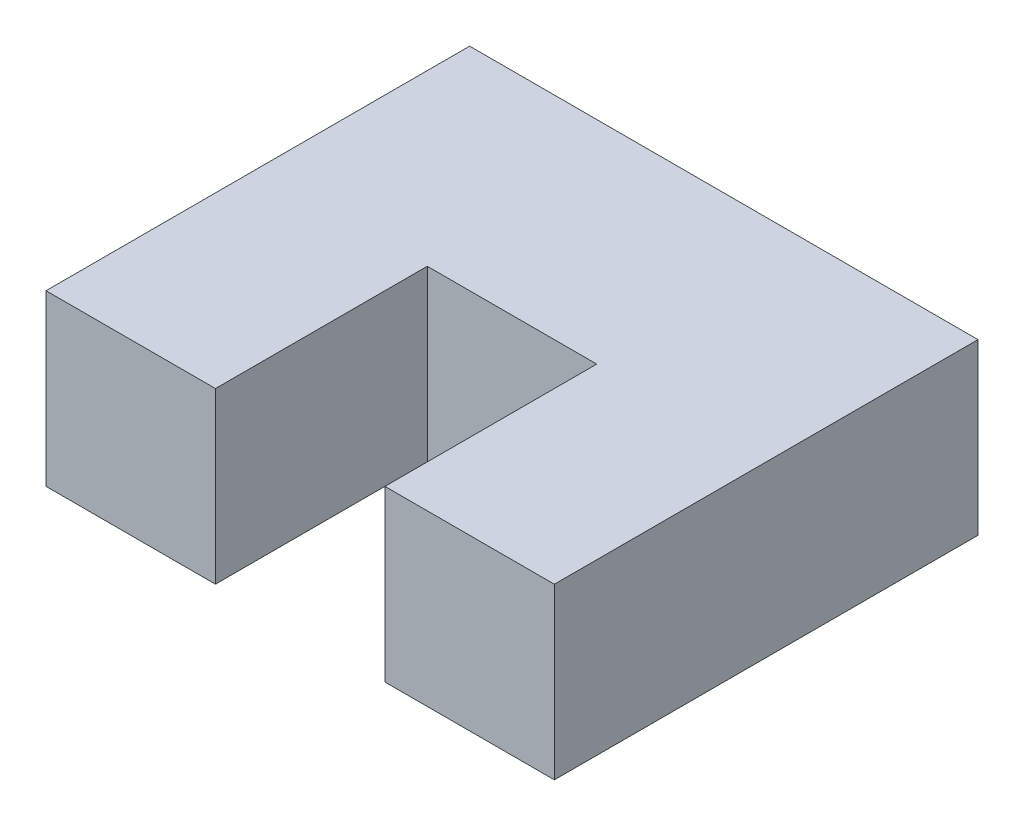
ISO-10303-21;
HEADER;
FILE_DESCRIPTION(('STEP AP214'),'2;1');
FILE_NAME('part.step','',(''),(''),'','','');
FILE_SCHEMA(('AUTOMOTIVE_DESIGN { 1 0 10303 214 1 1 1 1 }'));
ENDSEC;
DATA;
#1=APPLICATION_CONTEXT('core data for automotive mechanical design processes');
#2=APPLICATION_PROTOCOL_DEFINITION('international standard','automotive_design',2000,#1);
#3=PRODUCT_CONTEXT('',#1,'mechanical');
#4=PRODUCT('Part','Part','',(#3));
#5=PRODUCT_RELATED_PRODUCT_CATEGORY('part','',(#4));
#6=PRODUCT_DEFINITION_FORMATION('','',#4);
#7=PRODUCT_DEFINITION_CONTEXT('part definition',#1,'design');
#8=PRODUCT_DEFINITION('design','',#6,#7);
#9=PRODUCT_DEFINITION_SHAPE('','',#8);
#10=(LENGTH_UNIT() NAMED_UNIT(*) SI_UNIT(.MILLI.,.METRE.));
#11=(NAMED_UNIT(*) PLANE_ANGLE_UNIT() SI_UNIT($,.RADIAN.));
#12=(NAMED_UNIT(*) SI_UNIT($,.STERADIAN.) SOLID_ANGLE_UNIT());
#13=UNCERTAINTY_MEASURE_WITH_UNIT(LENGTH_MEASURE(1.E-05),#10,'distance_accuracy_value','');
#14=(GEOMETRIC_REPRESENTATION_CONTEXT(3) GLOBAL_UNCERTAINTY_ASSIGNED_CONTEXT((#13)) GLOBAL_UNIT_ASSIGNED_CONTEXT((#10,
#11,#12)) REPRESENTATION_CONTEXT('',''));
#15=CARTESIAN_POINT('',(0.,0.,0.));
#16=DIRECTION('',(0.,0.,1.));
#17=DIRECTION('',(1.,0.,0.));
#18=AXIS2_PLACEMENT_3D('',#15,#16,#17);
#19=CARTESIAN_POINT('',(30.0000000000001,-9.99999999999998,30.));
#20=DIRECTION('',(-1.,0.,0.));
#21=DIRECTION('',(0.,0.,1.));
#22=AXIS2_PLACEMENT_3D('',#19,#20,#21);
#23=PLANE('',#22);
#24=DIRECTION('',(0.,1.,0.));
#25=VECTOR('',#24,1.);
#26=CARTESIAN_POINT('',(30.0000000000001,-9.99999999999998,0.));
#27=LINE('',#26,#25);
#28=CARTESIAN_POINT('',(30.0000000000001,-9.99999999999998,0.));
#29=VERTEX_POINT('',#28);
#30=CARTESIAN_POINT('',(30.0000000000001,9.99999999999998,0.));
#31=VERTEX_POINT('',#30);
#32=EDGE_CURVE('E115',#29,#31,#27,.T.);
#33=ORIENTED_EDGE('',*,*,#32,.T.);
#34=DIRECTION('',(0.,0.,-1.));
#35=VECTOR('',#34,1.);
#36=CARTESIAN_POINT('',(30.0000000000001,9.99999999999998,30.));
#37=LINE('',#36,#35);
#38=CARTESIAN_POINT('',(30.0000000000001,9.99999999999998,50.));
#39=VERTEX_POINT('',#38);
#40=EDGE_CURVE('E11',#39,#31,#37,.T.);
#41=ORIENTED_EDGE('',*,*,#40,.F.);
#42=DIRECTION('',(0.,1.,0.));
#43=VECTOR('',#42,1.);
#44=CARTESIAN_POINT('',(30.0000000000001,9.99999999999998,50.));
#45=LINE('',#44,#43);
#46=CARTESIAN_POINT('',(30.0000000000001,-9.99999999999998,50.));
#47=VERTEX_POINT('',#46);
#48=EDGE_CURVE('E126',#47,#39,#45,.T.);
#49=ORIENTED_EDGE('',*,*,#48,.F.);
#50=DIRECTION('',(0.,0.,-1.));
#51=VECTOR('',#50,1.);
#52=CARTESIAN_POINT('',(30.0000000000001,-9.99999999999998,30.));
#53=LINE('',#52,#51);
#54=EDGE_CURVE('E121',#47,#29,#53,.T.);
#55=ORIENTED_EDGE('',*,*,#54,.T.);
#56=EDGE_LOOP('',(#33,#41,#49,#55));
#57=FACE_BOUND('',#56,.T.);
#58=ADVANCED_FACE('F39',(#57),#23,.F.);
#59=CARTESIAN_POINT('',(-29.9999999999999,9.99999999999998,30.));
#60=DIRECTION('',(0.,-1.,0.));
#61=DIRECTION('',(0.,0.,-1.));
#62=AXIS2_PLACEMENT_3D('',#59,#60,#61);
#63=PLANE('',#62);
#64=DIRECTION('',(-1.,0.,0.));
#65=VECTOR('',#64,1.);
#66=CARTESIAN_POINT('',(-10.,9.99999999999998,25.));
#67=LINE('',#66,#65);
#68=CARTESIAN_POINT('',(10.,9.99999999999998,25.));
#69=VERTEX_POINT('',#68);
#70=CARTESIAN_POINT('',(-10.,9.99999999999998,25.));
#71=VERTEX_POINT('',#70);
#72=EDGE_CURVE('E157',#69,#71,#67,.T.);
#73=ORIENTED_EDGE('',*,*,#72,.F.);
#74=DIRECTION('',(0.,0.,1.));
#75=VECTOR('',#74,1.);
#76=CARTESIAN_POINT('',(10.,9.99999999999998,25.));
#77=LINE('',#76,#75);
#78=CARTESIAN_POINT('',(10.,9.99999999999998,50.));
#79=VERTEX_POINT('',#78);
#80=EDGE_CURVE('E167',#69,#79,#77,.T.);
#81=ORIENTED_EDGE('',*,*,#80,.T.);
#82=DIRECTION('',(-1.,0.,0.));
#83=VECTOR('',#82,1.);
#84=CARTESIAN_POINT('',(10.,9.99999999999998,50.));
#85=LINE('',#84,#83);
#86=EDGE_CURVE('E131',#39,#79,#85,.T.);
#87=ORIENTED_EDGE('',*,*,#86,.F.);
#88=ORIENTED_EDGE('',*,*,#40,.T.);
#89=DIRECTION('',(-1.,0.,0.));
#90=VECTOR('',#89,1.);
#91=CARTESIAN_POINT('',(-29.9999999999999,9.99999999999998,0.));
#92=LINE('',#91,#90);
#93=CARTESIAN_POINT('',(-29.9999999999999,9.99999999999998,0.));
#94=VERTEX_POINT('',#93);
#95=EDGE_CURVE('E179',#31,#94,#92,.T.);
#96=ORIENTED_EDGE('',*,*,#95,.T.);
#97=DIRECTION('',(0.,0.,-1.));
#98=VECTOR('',#97,1.);
#99=CARTESIAN_POINT('',(-29.9999999999999,9.99999999999998,30.));
#100=LINE('',#99,#98);
#101=CARTESIAN_POINT('',(-29.9999999999999,9.99999999999998,50.));
#102=VERTEX_POINT('',#101);
#103=EDGE_CURVE('E47',#102,#94,#100,.T.);
#104=ORIENTED_EDGE('',*,*,#103,.F.);
#105=DIRECTION('',(-1.,0.,0.));
#106=VECTOR('',#105,1.);
#107=CARTESIAN_POINT('',(-29.9999999999999,9.99999999999998,50.));
#108=LINE('',#107,#106);
#109=CARTESIAN_POINT('',(-10.,9.99999999999998,50.));
#110=VERTEX_POINT('',#109);
#111=EDGE_CURVE('E151',#110,#102,#108,.T.);
#112=ORIENTED_EDGE('',*,*,#111,.F.);
#113=DIRECTION('',(0.,0.,1.));
#114=VECTOR('',#113,1.);
#115=CARTESIAN_POINT('',(-10.,9.99999999999998,25.));
#116=LINE('',#115,#114);
#117=EDGE_CURVE('E171',#71,#110,#116,.T.);
#118=ORIENTED_EDGE('',*,*,#117,.F.);
#119=EDGE_LOOP('',(#73,#81,#87,#88,#96,#104,#112,#118));
#120=FACE_BOUND('',#119,.T.);
#121=ADVANCED_FACE('F200',(#120),#63,.F.);
#122=CARTESIAN_POINT('',(-29.9999999999999,-9.99999999999998,30.));
#123=DIRECTION('',(1.,0.,0.));
#124=DIRECTION('',(0.,0.,-1.));
#125=AXIS2_PLACEMENT_3D('',#122,#123,#124);
#126=PLANE('',#125);
#127=DIRECTION('',(0.,-1.,0.));
#128=VECTOR('',#127,1.);
#129=CARTESIAN_POINT('',(-29.9999999999999,-9.99999999999998,0.));
#130=LINE('',#129,#128);
#131=CARTESIAN_POINT('',(-29.9999999999999,-9.99999999999998,0.));
#132=VERTEX_POINT('',#131);
#133=EDGE_CURVE('E62',#94,#132,#130,.T.);
#134=ORIENTED_EDGE('',*,*,#133,.T.);
#135=DIRECTION('',(0.,0.,-1.));
#136=VECTOR('',#135,1.);
#137=CARTESIAN_POINT('',(-29.9999999999999,-9.99999999999998,30.));
#138=LINE('',#137,#136);
#139=CARTESIAN_POINT('',(-29.9999999999999,-9.99999999999998,50.));
#140=VERTEX_POINT('',#139);
#141=EDGE_CURVE('E188',#140,#132,#138,.T.);
#142=ORIENTED_EDGE('',*,*,#141,.F.);
#143=DIRECTION('',(0.,-1.,0.));
#144=VECTOR('',#143,1.);
#145=CARTESIAN_POINT('',(-29.9999999999999,-9.99999999999998,50.));
#146=LINE('',#145,#144);
#147=EDGE_CURVE('E139',#102,#140,#146,.T.);
#148=ORIENTED_EDGE('',*,*,#147,.F.);
#149=ORIENTED_EDGE('',*,*,#103,.T.);
#150=EDGE_LOOP('',(#134,#142,#148,#149));
#151=FACE_BOUND('',#150,.T.);
#152=ADVANCED_FACE('F192',(#151),#126,.F.);
#153=CARTESIAN_POINT('',(-29.9999999999999,-9.99999999999998,30.));
#154=DIRECTION('',(0.,1.,0.));
#155=DIRECTION('',(0.,0.,1.));
#156=AXIS2_PLACEMENT_3D('',#153,#154,#155);
#157=PLANE('',#156);
#158=ORIENTED_EDGE('',*,*,#54,.F.);
#159=DIRECTION('',(1.,0.,0.));
#160=VECTOR('',#159,1.);
#161=CARTESIAN_POINT('',(10.,-9.99999999999998,50.));
#162=LINE('',#161,#160);
#163=CARTESIAN_POINT('',(10.,-9.99999999999998,50.));
#164=VERTEX_POINT('',#163);
#165=EDGE_CURVE('E119',#164,#47,#162,.T.);
#166=ORIENTED_EDGE('',*,*,#165,.F.);
#167=DIRECTION('',(0.,0.,1.));
#168=VECTOR('',#167,1.);
#169=CARTESIAN_POINT('',(10.,-9.99999999999998,25.));
#170=LINE('',#169,#168);
#171=CARTESIAN_POINT('',(10.,-9.99999999999998,25.));
#172=VERTEX_POINT('',#171);
#173=EDGE_CURVE('E105',#172,#164,#170,.T.);
#174=ORIENTED_EDGE('',*,*,#173,.F.);
#175=DIRECTION('',(1.,0.,0.));
#176=VECTOR('',#175,1.);
#177=CARTESIAN_POINT('',(-10.,-9.99999999999998,25.));
#178=LINE('',#177,#176);
#179=CARTESIAN_POINT('',(-10.,-9.99999999999998,25.));
#180=VERTEX_POINT('',#179);
#181=EDGE_CURVE('E165',#180,#172,#178,.T.);
#182=ORIENTED_EDGE('',*,*,#181,.F.);
#183=DIRECTION('',(0.,0.,1.));
#184=VECTOR('',#183,1.);
#185=CARTESIAN_POINT('',(-10.,-9.99999999999998,25.));
#186=LINE('',#185,#184);
#187=CARTESIAN_POINT('',(-10.,-9.99999999999998,50.));
#188=VERTEX_POINT('',#187);
#189=EDGE_CURVE('E116',#180,#188,#186,.T.);
#190=ORIENTED_EDGE('',*,*,#189,.T.);
#191=DIRECTION('',(1.,0.,0.));
#192=VECTOR('',#191,1.);
#193=CARTESIAN_POINT('',(-29.9999999999999,-9.99999999999998,50.));
#194=LINE('',#193,#192);
#195=EDGE_CURVE('E143',#140,#188,#194,.T.);
#196=ORIENTED_EDGE('',*,*,#195,.F.);
#197=ORIENTED_EDGE('',*,*,#141,.T.);
#198=DIRECTION('',(1.,0.,0.));
#199=VECTOR('',#198,1.);
#200=CARTESIAN_POINT('',(-29.9999999999999,-9.99999999999998,0.));
#201=LINE('',#200,#199);
#202=EDGE_CURVE('E54',#132,#29,#201,.T.);
#203=ORIENTED_EDGE('',*,*,#202,.T.);
#204=EDGE_LOOP('',(#158,#166,#174,#182,#190,#196,#197,#203));
#205=FACE_BOUND('',#204,.T.);
#206=ADVANCED_FACE('F120',(#205),#157,.F.);
#207=CARTESIAN_POINT('',(0.,0.,0.));
#208=DIRECTION('',(0.,0.,-1.));
#209=DIRECTION('',(-1.,0.,0.));
#210=AXIS2_PLACEMENT_3D('',#207,#208,#209);
#211=PLANE('',#210);
#212=ORIENTED_EDGE('',*,*,#32,.F.);
#213=ORIENTED_EDGE('',*,*,#202,.F.);
#214=ORIENTED_EDGE('',*,*,#133,.F.);
#215=ORIENTED_EDGE('',*,*,#95,.F.);
#216=EDGE_LOOP('',(#212,#213,#214,#215));
#217=FACE_BOUND('',#216,.T.);
#218=ADVANCED_FACE('F197',(#217),#211,.T.);
#219=CARTESIAN_POINT('',(10.,-9.99999999999998,25.));
#220=DIRECTION('',(1.,0.,0.));
#221=DIRECTION('',(0.,0.,-1.));
#222=AXIS2_PLACEMENT_3D('',#219,#220,#221);
#223=PLANE('',#222);
#224=ORIENTED_EDGE('',*,*,#173,.T.);
#225=DIRECTION('',(0.,-1.,0.));
#226=VECTOR('',#225,1.);
#227=CARTESIAN_POINT('',(10.,9.99999999999998,50.));
#228=LINE('',#227,#226);
#229=EDGE_CURVE('E109',#79,#164,#228,.T.);
#230=ORIENTED_EDGE('',*,*,#229,.F.);
#231=ORIENTED_EDGE('',*,*,#80,.F.);
#232=DIRECTION('',(0.,1.,0.));
#233=VECTOR('',#232,1.);
#234=CARTESIAN_POINT('',(10.,-9.99999999999998,25.));
#235=LINE('',#234,#233);
#236=EDGE_CURVE('E111',#172,#69,#235,.T.);
#237=ORIENTED_EDGE('',*,*,#236,.F.);
#238=EDGE_LOOP('',(#224,#230,#231,#237));
#239=FACE_BOUND('',#238,.T.);
#240=ADVANCED_FACE('F107',(#239),#223,.F.);
#241=CARTESIAN_POINT('',(-10.,-9.99999999999998,25.));
#242=DIRECTION('',(-1.,0.,0.));
#243=DIRECTION('',(0.,0.,1.));
#244=AXIS2_PLACEMENT_3D('',#241,#242,#243);
#245=PLANE('',#244);
#246=ORIENTED_EDGE('',*,*,#117,.T.);
#247=DIRECTION('',(0.,1.,0.));
#248=VECTOR('',#247,1.);
#249=CARTESIAN_POINT('',(-10.,-9.99999999999998,50.));
#250=LINE('',#249,#248);
#251=EDGE_CURVE('E147',#188,#110,#250,.T.);
#252=ORIENTED_EDGE('',*,*,#251,.F.);
#253=ORIENTED_EDGE('',*,*,#189,.F.);
#254=DIRECTION('',(0.,-1.,0.));
#255=VECTOR('',#254,1.);
#256=CARTESIAN_POINT('',(-10.,-9.99999999999998,25.));
#257=LINE('',#256,#255);
#258=EDGE_CURVE('E161',#71,#180,#257,.T.);
#259=ORIENTED_EDGE('',*,*,#258,.F.);
#260=EDGE_LOOP('',(#246,#252,#253,#259));
#261=FACE_BOUND('',#260,.T.);
#262=ADVANCED_FACE('F209',(#261),#245,.F.);
#263=CARTESIAN_POINT('',(0.,0.,25.));
#264=DIRECTION('',(0.,0.,-1.));
#265=DIRECTION('',(-1.,0.,0.));
#266=AXIS2_PLACEMENT_3D('',#263,#264,#265);
#267=PLANE('',#266);
#268=ORIENTED_EDGE('',*,*,#236,.T.);
#269=ORIENTED_EDGE('',*,*,#72,.T.);
#270=ORIENTED_EDGE('',*,*,#258,.T.);
#271=ORIENTED_EDGE('',*,*,#181,.T.);
#272=EDGE_LOOP('',(#268,#269,#270,#271));
#273=FACE_BOUND('',#272,.T.);
#274=ADVANCED_FACE('F203',(#273),#267,.F.);
#275=CARTESIAN_POINT('',(0.,0.,50.));
#276=DIRECTION('',(0.,0.,-1.));
#277=DIRECTION('',(-1.,0.,0.));
#278=AXIS2_PLACEMENT_3D('',#275,#276,#277);
#279=PLANE('',#278);
#280=ORIENTED_EDGE('',*,*,#147,.T.);
#281=ORIENTED_EDGE('',*,*,#195,.T.);
#282=ORIENTED_EDGE('',*,*,#251,.T.);
#283=ORIENTED_EDGE('',*,*,#111,.T.);
#284=EDGE_LOOP('',(#280,#281,#282,#283));
#285=FACE_BOUND('',#284,.T.);
#286=ADVANCED_FACE('F208',(#285),#279,.F.);
#287=CARTESIAN_POINT('',(0.,0.,50.));
#288=DIRECTION('',(0.,0.,1.));
#289=DIRECTION('',(1.,0.,0.));
#290=AXIS2_PLACEMENT_3D('',#287,#288,#289);
#291=PLANE('',#290);
#292=ORIENTED_EDGE('',*,*,#229,.T.);
#293=ORIENTED_EDGE('',*,*,#165,.T.);
#294=ORIENTED_EDGE('',*,*,#48,.T.);
#295=ORIENTED_EDGE('',*,*,#86,.T.);
#296=EDGE_LOOP('',(#292,#293,#294,#295));
#297=FACE_BOUND('',#296,.T.);
#298=ADVANCED_FACE('F129',(#297),#291,.T.);
#299=CLOSED_SHELL('',(#58,#121,#152,#206,#218,#240,#262,#274,#286,#298));
#300=MANIFOLD_SOLID_BREP('B2',#299);
#301=ADVANCED_BREP_SHAPE_REPRESENTATION('',(#18,#300),#14);
#302=SHAPE_DEFINITION_REPRESENTATION(#9,#301);
ENDSEC;
END-ISO-10303-21;
